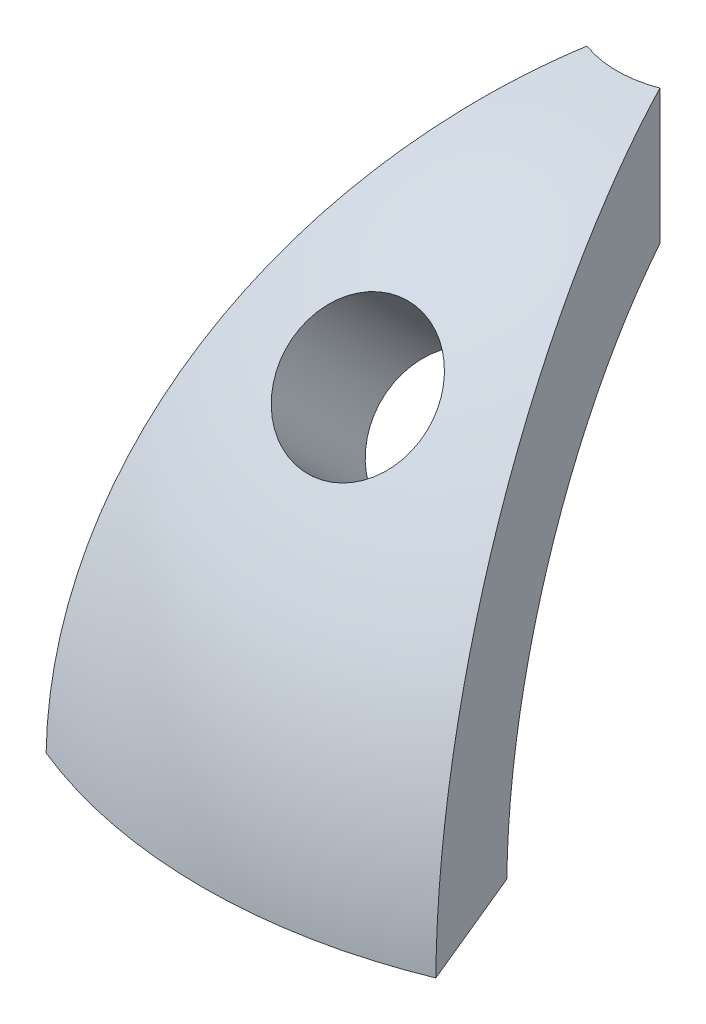
ISO-10303-21;
HEADER;
FILE_DESCRIPTION(('STEP AP214'),'2;1');
FILE_NAME('part.step','',(''),(''),'','','');
FILE_SCHEMA(('AUTOMOTIVE_DESIGN { 1 0 10303 214 1 1 1 1 }'));
ENDSEC;
DATA;
#1=APPLICATION_CONTEXT('core data for automotive mechanical design processes');
#2=APPLICATION_PROTOCOL_DEFINITION('international standard','automotive_design',2000,#1);
#3=PRODUCT_CONTEXT('',#1,'mechanical');
#4=PRODUCT('Part','Part','',(#3));
#5=PRODUCT_RELATED_PRODUCT_CATEGORY('part','',(#4));
#6=PRODUCT_DEFINITION_FORMATION('','',#4);
#7=PRODUCT_DEFINITION_CONTEXT('part definition',#1,'design');
#8=PRODUCT_DEFINITION('design','',#6,#7);
#9=PRODUCT_DEFINITION_SHAPE('','',#8);
#10=(LENGTH_UNIT() NAMED_UNIT(*) SI_UNIT(.MILLI.,.METRE.));
#11=(NAMED_UNIT(*) PLANE_ANGLE_UNIT() SI_UNIT($,.RADIAN.));
#12=(NAMED_UNIT(*) SI_UNIT($,.STERADIAN.) SOLID_ANGLE_UNIT());
#13=UNCERTAINTY_MEASURE_WITH_UNIT(LENGTH_MEASURE(1.E-05),#10,'distance_accuracy_value','');
#14=(GEOMETRIC_REPRESENTATION_CONTEXT(3) GLOBAL_UNCERTAINTY_ASSIGNED_CONTEXT((#13)) GLOBAL_UNIT_ASSIGNED_CONTEXT((#10,
#11,#12)) REPRESENTATION_CONTEXT('',''));
#15=CARTESIAN_POINT('',(0.,0.,0.));
#16=DIRECTION('',(0.,0.,1.));
#17=DIRECTION('',(1.,0.,0.));
#18=AXIS2_PLACEMENT_3D('',#15,#16,#17);
#19=CARTESIAN_POINT('',(0.,0.,0.));
#20=DIRECTION('',(0.,-1.,0.));
#21=DIRECTION('',(0.382683432365091,0.,0.923879532511287));
#22=AXIS2_PLACEMENT_3D('',#19,#20,#21);
#23=SPHERICAL_SURFACE('',#22,14.22);
#24=CARTESIAN_POINT('',(0.,9.88509453040283,9.88509453040284));
#25=DIRECTION('',(0.,-0.707106781186548,-0.707106781186547));
#26=DIRECTION('',(0.,0.707106781186547,-0.707106781186548));
#27=AXIS2_PLACEMENT_3D('',#24,#25,#26);
#28=CIRCLE('',#27,2.6035);
#29=CARTESIAN_POINT('',(0.,11.726047035222,8.04414202558366));
#30=VERTEX_POINT('',#29);
#31=EDGE_CURVE('E155',#30,#30,#28,.F.);
#32=ORIENTED_EDGE('',*,*,#31,.T.);
#33=EDGE_LOOP('',(#32));
#34=FACE_BOUND('',#33,.T.);
#35=CARTESIAN_POINT('',(-0.227948717948719,0.,0.));
#36=DIRECTION('',(1.,0.,0.));
#37=DIRECTION('',(0.,0.,-1.));
#38=AXIS2_PLACEMENT_3D('',#35,#36,#37);
#39=CIRCLE('',#38,14.2181728566643);
#40=CARTESIAN_POINT('',(-0.227948717948711,5.90423307640366,12.9343137104945));
#41=VERTEX_POINT('',#40);
#42=CARTESIAN_POINT('',(-0.227948717948721,1.58794625798899,14.1292202921366));
#43=VERTEX_POINT('',#42);
#44=EDGE_CURVE('E134',#41,#43,#39,.T.);
#45=ORIENTED_EDGE('',*,*,#44,.T.);
#46=CARTESIAN_POINT('',(0.,-3.64003682813778,1.50775262175221));
#47=DIRECTION('',(0.,0.923879532511287,-0.38268343236509));
#48=DIRECTION('',(0.,0.38268343236509,0.923879532511287));
#49=AXIS2_PLACEMENT_3D('',#46,#47,#48);
#50=CIRCLE('',#49,13.6632797644416);
#51=CARTESIAN_POINT('',(0.170961538461535,1.58826464423088,14.1299889445199));
#52=VERTEX_POINT('',#51);
#53=EDGE_CURVE('E125',#43,#52,#50,.T.);
#54=ORIENTED_EDGE('',*,*,#53,.T.);
#55=CARTESIAN_POINT('',(0.170961538461537,0.,0.));
#56=DIRECTION('',(-1.,0.,0.));
#57=DIRECTION('',(0.,0.,1.));
#58=AXIS2_PLACEMENT_3D('',#55,#56,#57);
#59=CIRCLE('',#58,14.2189722607637);
#60=CARTESIAN_POINT('',(0.170961538461537,5.48674597867489,13.1177281080933));
#61=VERTEX_POINT('',#60);
#62=EDGE_CURVE('E111',#52,#61,#59,.T.);
#63=ORIENTED_EDGE('',*,*,#62,.T.);
#64=CARTESIAN_POINT('',(0.,0.0454133839248742,-0.0188108395349421));
#65=DIRECTION('',(0.,0.923879532511287,-0.38268343236509));
#66=DIRECTION('',(0.,0.38268343236509,0.923879532511287));
#67=AXIS2_PLACEMENT_3D('',#64,#65,#66);
#68=CIRCLE('',#67,14.2199150411272);
#69=CARTESIAN_POINT('',(0.854807692307691,5.47729820838699,13.0949191729301));
#70=VERTEX_POINT('',#69);
#71=EDGE_CURVE('E142',#61,#70,#68,.T.);
#72=ORIENTED_EDGE('',*,*,#71,.T.);
#73=CARTESIAN_POINT('',(0.665119005428744,0.351651409940158,-0.145658783224837));
#74=DIRECTION('',(-0.867930013859709,-0.458878502361261,0.190073699159489));
#75=DIRECTION('',(0.467399272996336,-0.884046333402552,0.));
#76=AXIS2_PLACEMENT_3D('',#73,#74,#75);
#77=CIRCLE('',#76,14.1993359532541);
#78=CARTESIAN_POINT('',(0.593913261217949,5.90018135314951,12.9245319852634));
#79=VERTEX_POINT('',#78);
#80=EDGE_CURVE('E145',#70,#79,#77,.T.);
#81=ORIENTED_EDGE('',*,*,#80,.T.);
#82=CARTESIAN_POINT('',(0.,0.46660769387489,-0.193275235110616));
#83=DIRECTION('',(0.,-0.923879532511287,0.38268343236509));
#84=DIRECTION('',(0.,-0.38268343236509,-0.923879532511287));
#85=AXIS2_PLACEMENT_3D('',#82,#83,#84);
#86=CIRCLE('',#85,14.2110281803784);
#87=EDGE_CURVE('E149',#79,#41,#86,.T.);
#88=ORIENTED_EDGE('',*,*,#87,.T.);
#89=EDGE_LOOP('',(#45,#54,#63,#72,#81,#88));
#90=FACE_BOUND('',#89,.T.);
#91=CARTESIAN_POINT('',(-0.115484941563909,0.,0.0478354290456357));
#92=DIRECTION('',(0.923879532511287,0.,-0.382683432365091));
#93=DIRECTION('',(-0.38268343236509,0.,-0.923879532511286));
#94=AXIS2_PLACEMENT_3D('',#91,#92,#93);
#95=CIRCLE('',#94,14.2194505871359);
#96=CARTESIAN_POINT('',(5.32522212941495,0.249999999999996,13.182864228702));
#97=VERTEX_POINT('',#96);
#98=CARTESIAN_POINT('',(1.34175402255179,13.7000839413487,3.56592149983228));
#99=VERTEX_POINT('',#98);
#100=EDGE_CURVE('E173',#97,#99,#95,.F.);
#101=ORIENTED_EDGE('',*,*,#100,.F.);
#102=CARTESIAN_POINT('',(0.,0.249999999999996,0.));
#103=DIRECTION('',(0.,-1.,0.));
#104=DIRECTION('',(0.,0.,-1.));
#105=AXIS2_PLACEMENT_3D('',#102,#103,#104);
#106=CIRCLE('',#105,14.2178022211592);
#107=CARTESIAN_POINT('',(-5.32522212941495,0.249999999999996,13.182864228702));
#108=VERTEX_POINT('',#107);
#109=EDGE_CURVE('E175',#97,#108,#106,.T.);
#110=ORIENTED_EDGE('',*,*,#109,.T.);
#111=CARTESIAN_POINT('',(0.115484941563912,0.,0.0478354290456367));
#112=DIRECTION('',(-0.923879532511286,0.,-0.382683432365091));
#113=DIRECTION('',(-0.382683432365091,0.,0.923879532511286));
#114=AXIS2_PLACEMENT_3D('',#111,#112,#113);
#115=CIRCLE('',#114,14.2194505871359);
#116=CARTESIAN_POINT('',(-1.34175402255179,13.7000839413487,3.56592149983228));
#117=VERTEX_POINT('',#116);
#118=EDGE_CURVE('E59',#117,#108,#115,.F.);
#119=ORIENTED_EDGE('',*,*,#118,.F.);
#120=CARTESIAN_POINT('',(0.,13.7000839413487,0.));
#121=DIRECTION('',(0.,-1.,0.));
#122=DIRECTION('',(0.,0.,-1.));
#123=AXIS2_PLACEMENT_3D('',#120,#121,#122);
#124=CIRCLE('',#123,3.81);
#125=EDGE_CURVE('E184',#99,#117,#124,.T.);
#126=ORIENTED_EDGE('',*,*,#125,.F.);
#127=EDGE_LOOP('',(#101,#110,#119,#126));
#128=FACE_BOUND('',#127,.T.);
#129=ADVANCED_FACE('F35',(#34,#90,#128),#23,.F.);
#130=CARTESIAN_POINT('',(0.,0.,0.));
#131=DIRECTION('',(0.,-1.,0.));
#132=DIRECTION('',(0.,0.,-1.));
#133=AXIS2_PLACEMENT_3D('',#130,#131,#132);
#134=CYLINDRICAL_SURFACE('',#133,3.81);
#135=DIRECTION('',(0.,-1.,0.));
#136=VECTOR('',#135,1.);
#137=CARTESIAN_POINT('',(1.34175402255179,0.249999999999994,3.56592149983228));
#138=LINE('',#137,#136);
#139=CARTESIAN_POINT('',(1.34175402255179,18.6651118400078,3.56592149983228));
#140=VERTEX_POINT('',#139);
#141=EDGE_CURVE('E164',#140,#99,#138,.T.);
#142=ORIENTED_EDGE('',*,*,#141,.T.);
#143=ORIENTED_EDGE('',*,*,#125,.T.);
#144=DIRECTION('',(0.,-1.,0.));
#145=VECTOR('',#144,1.);
#146=CARTESIAN_POINT('',(-1.34175402255179,0.249999999999994,3.56592149983228));
#147=LINE('',#146,#145);
#148=CARTESIAN_POINT('',(-1.34175402255179,18.6651118400078,3.56592149983228));
#149=VERTEX_POINT('',#148);
#150=EDGE_CURVE('E119',#149,#117,#147,.T.);
#151=ORIENTED_EDGE('',*,*,#150,.F.);
#152=CARTESIAN_POINT('',(0.,18.6651118400078,0.));
#153=DIRECTION('',(0.,-1.,0.));
#154=DIRECTION('',(0.,0.,-1.));
#155=AXIS2_PLACEMENT_3D('',#152,#153,#154);
#156=CIRCLE('',#155,3.81);
#157=EDGE_CURVE('E181',#140,#149,#156,.T.);
#158=ORIENTED_EDGE('',*,*,#157,.F.);
#159=EDGE_LOOP('',(#142,#143,#151,#158));
#160=FACE_BOUND('',#159,.T.);
#161=ADVANCED_FACE('F37',(#160),#134,.F.);
#162=CARTESIAN_POINT('',(0.,0.,0.));
#163=DIRECTION('',(0.,-1.,0.));
#164=DIRECTION('',(0.382683432365091,0.,0.923879532511287));
#165=AXIS2_PLACEMENT_3D('',#162,#163,#164);
#166=SPHERICAL_SURFACE('',#165,19.05);
#167=CARTESIAN_POINT('',(0.,13.3439928010697,13.3439928010697));
#168=DIRECTION('',(0.,-0.707106781186548,-0.707106781186547));
#169=DIRECTION('',(0.,0.707106781186547,-0.707106781186548));
#170=AXIS2_PLACEMENT_3D('',#167,#168,#169);
#171=CIRCLE('',#170,2.6035);
#172=CARTESIAN_POINT('',(0.,15.1849453058889,11.5030402962505));
#173=VERTEX_POINT('',#172);
#174=EDGE_CURVE('E39',#173,#173,#171,.T.);
#175=ORIENTED_EDGE('',*,*,#174,.T.);
#176=EDGE_LOOP('',(#175));
#177=FACE_BOUND('',#176,.T.);
#178=CARTESIAN_POINT('',(-0.115484941563909,0.,0.0478354290456357));
#179=DIRECTION('',(0.923879532511287,0.,-0.382683432365091));
#180=DIRECTION('',(-0.38268343236509,0.,-0.923879532511286));
#181=AXIS2_PLACEMENT_3D('',#178,#179,#180);
#182=CIRCLE('',#181,19.0495898905987);
#183=CARTESIAN_POINT('',(7.17384970083417,0.249999999999994,17.6458459833991));
#184=VERTEX_POINT('',#183);
#185=EDGE_CURVE('E171',#140,#184,#182,.T.);
#186=ORIENTED_EDGE('',*,*,#185,.F.);
#187=ORIENTED_EDGE('',*,*,#157,.T.);
#188=CARTESIAN_POINT('',(0.115484941563912,0.,0.0478354290456367));
#189=DIRECTION('',(-0.923879532511286,0.,-0.382683432365091));
#190=DIRECTION('',(-0.382683432365091,0.,0.923879532511286));
#191=AXIS2_PLACEMENT_3D('',#188,#189,#190);
#192=CIRCLE('',#191,19.0495898905987);
#193=CARTESIAN_POINT('',(-7.17384970083417,0.249999999999995,17.6458459833991));
#194=VERTEX_POINT('',#193);
#195=EDGE_CURVE('E167',#194,#149,#192,.T.);
#196=ORIENTED_EDGE('',*,*,#195,.F.);
#197=CARTESIAN_POINT('',(0.,0.249999999999994,0.));
#198=DIRECTION('',(0.,-1.,0.));
#199=DIRECTION('',(0.,0.,-1.));
#200=AXIS2_PLACEMENT_3D('',#197,#198,#199);
#201=CIRCLE('',#200,19.0483595094171);
#202=EDGE_CURVE('E178',#184,#194,#201,.T.);
#203=ORIENTED_EDGE('',*,*,#202,.F.);
#204=EDGE_LOOP('',(#186,#187,#196,#203));
#205=FACE_BOUND('',#204,.T.);
#206=ADVANCED_FACE('F195',(#177,#205),#166,.T.);
#207=CARTESIAN_POINT('',(5.44091735468122,0.249999999999995,13.1355364694225));
#208=DIRECTION('',(0.,1.,0.));
#209=DIRECTION('',(0.,0.,1.));
#210=AXIS2_PLACEMENT_3D('',#207,#208,#209);
#211=PLANE('',#210);
#212=DIRECTION('',(-0.38268343236509,0.,-0.923879532511286));
#213=VECTOR('',#212,1.);
#214=CARTESIAN_POINT('',(5.32543241311731,0.249999999999995,13.1833718984682));
#215=LINE('',#214,#213);
#216=EDGE_CURVE('E11',#184,#97,#215,.T.);
#217=ORIENTED_EDGE('',*,*,#216,.F.);
#218=ORIENTED_EDGE('',*,*,#202,.T.);
#219=DIRECTION('',(-0.382683432365091,0.,0.923879532511286));
#220=VECTOR('',#219,1.);
#221=CARTESIAN_POINT('',(-3.73182461580675,0.249999999999995,9.33606234109748));
#222=LINE('',#221,#220);
#223=EDGE_CURVE('E44',#108,#194,#222,.T.);
#224=ORIENTED_EDGE('',*,*,#223,.F.);
#225=ORIENTED_EDGE('',*,*,#109,.F.);
#226=EDGE_LOOP('',(#217,#218,#224,#225));
#227=FACE_BOUND('',#226,.T.);
#228=ADVANCED_FACE('F198',(#227),#211,.F.);
#229=CARTESIAN_POINT('',(-7.17384970083417,0.249999999999994,17.6458459833991));
#230=DIRECTION('',(-0.923879532511286,0.,-0.382683432365091));
#231=DIRECTION('',(-0.382683432365091,0.,0.923879532511286));
#232=AXIS2_PLACEMENT_3D('',#229,#230,#231);
#233=PLANE('',#232);
#234=ORIENTED_EDGE('',*,*,#118,.T.);
#235=ORIENTED_EDGE('',*,*,#223,.T.);
#236=ORIENTED_EDGE('',*,*,#195,.T.);
#237=ORIENTED_EDGE('',*,*,#150,.T.);
#238=EDGE_LOOP('',(#234,#235,#236,#237));
#239=FACE_BOUND('',#238,.T.);
#240=ADVANCED_FACE('F188',(#239),#233,.T.);
#241=CARTESIAN_POINT('',(7.17384970083417,0.249999999999994,17.6458459833991));
#242=DIRECTION('',(0.923879532511287,0.,-0.382683432365091));
#243=DIRECTION('',(-0.38268343236509,0.,-0.923879532511286));
#244=AXIS2_PLACEMENT_3D('',#241,#242,#243);
#245=PLANE('',#244);
#246=ORIENTED_EDGE('',*,*,#100,.T.);
#247=ORIENTED_EDGE('',*,*,#141,.F.);
#248=ORIENTED_EDGE('',*,*,#185,.T.);
#249=ORIENTED_EDGE('',*,*,#216,.T.);
#250=EDGE_LOOP('',(#246,#247,#248,#249));
#251=FACE_BOUND('',#250,.T.);
#252=ADVANCED_FACE('F201',(#251),#245,.T.);
#253=CARTESIAN_POINT('',(0.,0.145802387731092,0.3519981018868));
#254=DIRECTION('',(0.,-1.,0.));
#255=DIRECTION('',(0.382683432365091,0.,0.923879532511287));
#256=AXIS2_PLACEMENT_3D('',#253,#254,#255);
#257=SPHERICAL_SURFACE('',#256,14.22);
#258=CARTESIAN_POINT('',(0.170961538461537,0.145802387731092,0.3519981018868));
#259=DIRECTION('',(-1.,0.,0.));
#260=DIRECTION('',(0.,0.,1.));
#261=AXIS2_PLACEMENT_3D('',#258,#259,#260);
#262=CIRCLE('',#261,14.2189722607637);
#263=CARTESIAN_POINT('',(0.170961538461535,1.73406703196198,14.4819870464067));
#264=VERTEX_POINT('',#263);
#265=CARTESIAN_POINT('',(0.170961538461538,5.63254836640599,13.4697262099801));
#266=VERTEX_POINT('',#265);
#267=EDGE_CURVE('E120',#264,#266,#262,.T.);
#268=ORIENTED_EDGE('',*,*,#267,.F.);
#269=CARTESIAN_POINT('',(0.,-3.49423444040668,1.85975072363901));
#270=DIRECTION('',(0.,0.923879532511287,-0.38268343236509));
#271=DIRECTION('',(0.,0.38268343236509,0.923879532511287));
#272=AXIS2_PLACEMENT_3D('',#269,#270,#271);
#273=CIRCLE('',#272,13.6632797644416);
#274=CARTESIAN_POINT('',(-0.227948717948721,1.73374864572009,14.4812183940234));
#275=VERTEX_POINT('',#274);
#276=EDGE_CURVE('E128',#275,#264,#273,.T.);
#277=ORIENTED_EDGE('',*,*,#276,.F.);
#278=CARTESIAN_POINT('',(-0.227948717948719,0.145802387731092,0.3519981018868));
#279=DIRECTION('',(1.,0.,0.));
#280=DIRECTION('',(0.,0.,-1.));
#281=AXIS2_PLACEMENT_3D('',#278,#279,#280);
#282=CIRCLE('',#281,14.2181728566643);
#283=CARTESIAN_POINT('',(-0.227948717948711,6.05003546413476,13.2863118123813));
#284=VERTEX_POINT('',#283);
#285=EDGE_CURVE('E129',#284,#275,#282,.T.);
#286=ORIENTED_EDGE('',*,*,#285,.F.);
#287=CARTESIAN_POINT('',(0.,0.61241008160599,0.158722866776184));
#288=DIRECTION('',(0.,-0.923879532511287,0.38268343236509));
#289=DIRECTION('',(0.,-0.38268343236509,-0.923879532511287));
#290=AXIS2_PLACEMENT_3D('',#287,#288,#289);
#291=CIRCLE('',#290,14.2110281803784);
#292=CARTESIAN_POINT('',(0.593913261217949,6.04598374088061,13.2765300871502));
#293=VERTEX_POINT('',#292);
#294=EDGE_CURVE('E150',#293,#284,#291,.T.);
#295=ORIENTED_EDGE('',*,*,#294,.F.);
#296=CARTESIAN_POINT('',(0.665119005428744,0.497453797671257,0.206339318661963));
#297=DIRECTION('',(-0.867930013859709,-0.458878502361261,0.190073699159489));
#298=DIRECTION('',(0.467399272996336,-0.884046333402552,0.));
#299=AXIS2_PLACEMENT_3D('',#296,#297,#298);
#300=CIRCLE('',#299,14.1993359532541);
#301=CARTESIAN_POINT('',(0.854807692307691,5.62310059611809,13.4469172748169));
#302=VERTEX_POINT('',#301);
#303=EDGE_CURVE('E146',#302,#293,#300,.T.);
#304=ORIENTED_EDGE('',*,*,#303,.F.);
#305=CARTESIAN_POINT('',(0.,0.191215771655973,0.333187262351858));
#306=DIRECTION('',(0.,0.923879532511287,-0.38268343236509));
#307=DIRECTION('',(0.,0.38268343236509,0.923879532511287));
#308=AXIS2_PLACEMENT_3D('',#305,#306,#307);
#309=CIRCLE('',#308,14.2199150411272);
#310=EDGE_CURVE('E143',#266,#302,#309,.T.);
#311=ORIENTED_EDGE('',*,*,#310,.F.);
#312=EDGE_LOOP('',(#268,#277,#286,#295,#304,#311));
#313=FACE_BOUND('',#312,.T.);
#314=ADVANCED_FACE('F225',(#313),#257,.F.);
#315=CARTESIAN_POINT('',(0.170961538461537,1.58826464423088,14.1299889445198));
#316=DIRECTION('',(0.,-0.923879532511287,0.38268343236509));
#317=DIRECTION('',(0.,-0.38268343236509,-0.923879532511287));
#318=AXIS2_PLACEMENT_3D('',#315,#316,#317);
#319=PLANE('',#318);
#320=ORIENTED_EDGE('',*,*,#276,.T.);
#321=DIRECTION('',(0.,0.38268343236509,0.923879532511287));
#322=VECTOR('',#321,1.);
#323=CARTESIAN_POINT('',(0.170961538461537,1.58826464423088,14.1299889445198));
#324=LINE('',#323,#322);
#325=EDGE_CURVE('E114',#52,#264,#324,.T.);
#326=ORIENTED_EDGE('',*,*,#325,.F.);
#327=ORIENTED_EDGE('',*,*,#53,.F.);
#328=DIRECTION('',(0.,0.38268343236509,0.923879532511287));
#329=VECTOR('',#328,1.);
#330=CARTESIAN_POINT('',(-0.227948717948719,1.58794625798899,14.1292202921366));
#331=LINE('',#330,#329);
#332=EDGE_CURVE('E135',#43,#275,#331,.T.);
#333=ORIENTED_EDGE('',*,*,#332,.T.);
#334=EDGE_LOOP('',(#320,#326,#327,#333));
#335=FACE_BOUND('',#334,.T.);
#336=ADVANCED_FACE('F123',(#335),#319,.F.);
#337=CARTESIAN_POINT('',(-0.227948717948719,1.58794625798899,14.1292202921366));
#338=DIRECTION('',(-1.,0.,0.));
#339=DIRECTION('',(0.,-1.,0.));
#340=AXIS2_PLACEMENT_3D('',#337,#338,#339);
#341=PLANE('',#340);
#342=ORIENTED_EDGE('',*,*,#285,.T.);
#343=ORIENTED_EDGE('',*,*,#332,.F.);
#344=ORIENTED_EDGE('',*,*,#44,.F.);
#345=DIRECTION('',(0.,0.38268343236509,0.923879532511287));
#346=VECTOR('',#345,1.);
#347=CARTESIAN_POINT('',(-0.227948717948703,5.90423307640366,12.9343137104945));
#348=LINE('',#347,#346);
#349=EDGE_CURVE('E154',#41,#284,#348,.T.);
#350=ORIENTED_EDGE('',*,*,#349,.T.);
#351=EDGE_LOOP('',(#342,#343,#344,#350));
#352=FACE_BOUND('',#351,.T.);
#353=ADVANCED_FACE('F251',(#352),#341,.F.);
#354=CARTESIAN_POINT('',(-0.227948717948703,5.90423307640366,12.9343137104945));
#355=DIRECTION('',(0.,0.923879532511287,-0.38268343236509));
#356=DIRECTION('',(0.,0.38268343236509,0.923879532511287));
#357=AXIS2_PLACEMENT_3D('',#354,#355,#356);
#358=PLANE('',#357);
#359=ORIENTED_EDGE('',*,*,#294,.T.);
#360=ORIENTED_EDGE('',*,*,#349,.F.);
#361=ORIENTED_EDGE('',*,*,#87,.F.);
#362=DIRECTION('',(0.,0.38268343236509,0.923879532511287));
#363=VECTOR('',#362,1.);
#364=CARTESIAN_POINT('',(0.593913261217948,5.90018135314952,12.9245319852634));
#365=LINE('',#364,#363);
#366=EDGE_CURVE('E152',#79,#293,#365,.T.);
#367=ORIENTED_EDGE('',*,*,#366,.T.);
#368=EDGE_LOOP('',(#359,#360,#361,#367));
#369=FACE_BOUND('',#368,.T.);
#370=ADVANCED_FACE('F247',(#369),#358,.F.);
#371=CARTESIAN_POINT('',(0.593913261217948,5.90018135314952,12.9245319852634));
#372=DIRECTION('',(0.867930013859709,0.45887850236126,-0.190073699159488));
#373=DIRECTION('',(-0.467399272996335,0.884046333402553,0.));
#374=AXIS2_PLACEMENT_3D('',#371,#372,#373);
#375=PLANE('',#374);
#376=ORIENTED_EDGE('',*,*,#303,.T.);
#377=ORIENTED_EDGE('',*,*,#366,.F.);
#378=ORIENTED_EDGE('',*,*,#80,.F.);
#379=DIRECTION('',(0.,0.38268343236509,0.923879532511287));
#380=VECTOR('',#379,1.);
#381=CARTESIAN_POINT('',(0.854807692307691,5.47729820838699,13.0949191729301));
#382=LINE('',#381,#380);
#383=EDGE_CURVE('E148',#70,#302,#382,.T.);
#384=ORIENTED_EDGE('',*,*,#383,.T.);
#385=EDGE_LOOP('',(#376,#377,#378,#384));
#386=FACE_BOUND('',#385,.T.);
#387=ADVANCED_FACE('F241',(#386),#375,.F.);
#388=CARTESIAN_POINT('',(0.854807692307691,5.47729820838699,13.0949191729301));
#389=DIRECTION('',(0.,-0.923879532511287,0.38268343236509));
#390=DIRECTION('',(0.,-0.38268343236509,-0.923879532511287));
#391=AXIS2_PLACEMENT_3D('',#388,#389,#390);
#392=PLANE('',#391);
#393=ORIENTED_EDGE('',*,*,#310,.T.);
#394=ORIENTED_EDGE('',*,*,#383,.F.);
#395=ORIENTED_EDGE('',*,*,#71,.F.);
#396=DIRECTION('',(0.,0.38268343236509,0.923879532511287));
#397=VECTOR('',#396,1.);
#398=CARTESIAN_POINT('',(0.170961538461537,5.48674597867489,13.1177281080933));
#399=LINE('',#398,#397);
#400=EDGE_CURVE('E51',#61,#266,#399,.T.);
#401=ORIENTED_EDGE('',*,*,#400,.T.);
#402=EDGE_LOOP('',(#393,#394,#395,#401));
#403=FACE_BOUND('',#402,.T.);
#404=ADVANCED_FACE('F233',(#403),#392,.F.);
#405=CARTESIAN_POINT('',(0.170961538461537,5.48674597867489,13.1177281080933));
#406=DIRECTION('',(1.,0.,0.));
#407=DIRECTION('',(0.,0.,-1.));
#408=AXIS2_PLACEMENT_3D('',#405,#406,#407);
#409=PLANE('',#408);
#410=ORIENTED_EDGE('',*,*,#267,.T.);
#411=ORIENTED_EDGE('',*,*,#400,.F.);
#412=ORIENTED_EDGE('',*,*,#62,.F.);
#413=ORIENTED_EDGE('',*,*,#325,.T.);
#414=EDGE_LOOP('',(#410,#411,#412,#413));
#415=FACE_BOUND('',#414,.T.);
#416=ADVANCED_FACE('F113',(#415),#409,.F.);
#417=CARTESIAN_POINT('',(0.,1.90796074991613,1.90796074991614));
#418=DIRECTION('',(0.,0.707106781186548,0.707106781186547));
#419=DIRECTION('',(0.,-0.707106781186547,0.707106781186548));
#420=AXIS2_PLACEMENT_3D('',#417,#418,#419);
#421=CYLINDRICAL_SURFACE('',#420,2.6035);
#422=ORIENTED_EDGE('',*,*,#174,.F.);
#423=EDGE_LOOP('',(#422));
#424=FACE_BOUND('',#423,.T.);
#425=ORIENTED_EDGE('',*,*,#31,.F.);
#426=EDGE_LOOP('',(#425));
#427=FACE_BOUND('',#426,.T.);
#428=ADVANCED_FACE('F231',(#424,#427),#421,.F.);
#429=CLOSED_SHELL('',(#129,#161,#206,#228,#240,#252,#314,#336,#353,#370,#387,#404,#416,#428));
#430=MANIFOLD_SOLID_BREP('B2',#429);
#431=ADVANCED_BREP_SHAPE_REPRESENTATION('',(#18,#430),#14);
#432=SHAPE_DEFINITION_REPRESENTATION(#9,#431);
ENDSEC;
END-ISO-10303-21;
